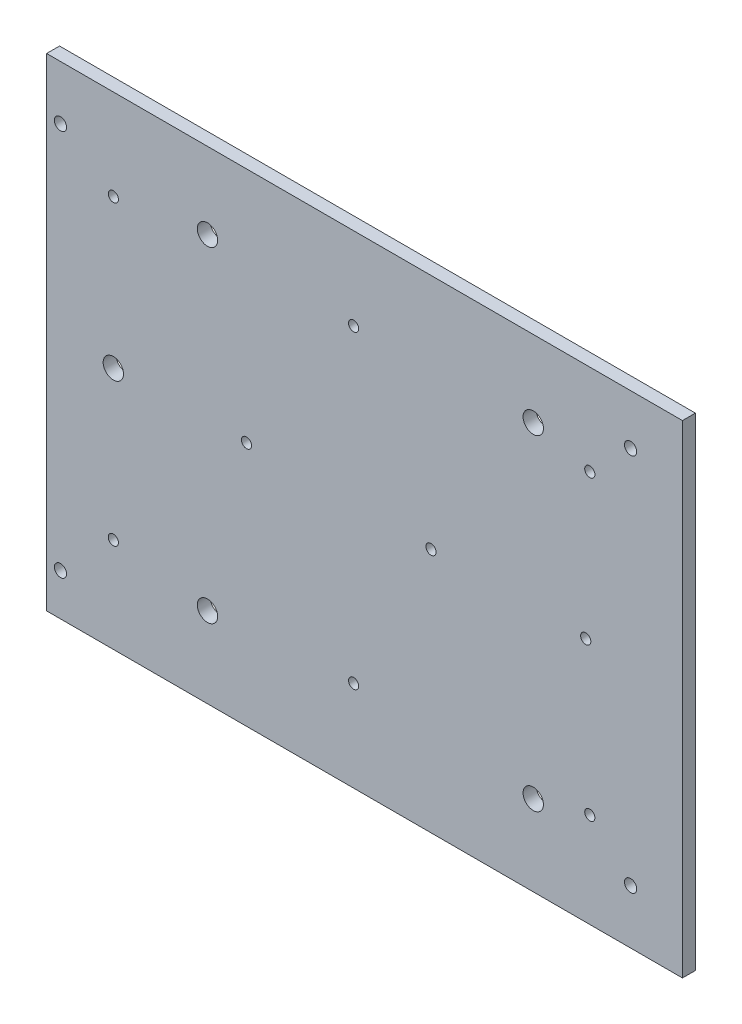
ISO-10303-21;
HEADER;
FILE_DESCRIPTION(('STEP AP214'),'2;1');
FILE_NAME('part.step','',(''),(''),'','','');
FILE_SCHEMA(('AUTOMOTIVE_DESIGN { 1 0 10303 214 1 1 1 1 }'));
ENDSEC;
DATA;
#1=APPLICATION_CONTEXT('core data for automotive mechanical design processes');
#2=APPLICATION_PROTOCOL_DEFINITION('international standard','automotive_design',2000,#1);
#3=PRODUCT_CONTEXT('',#1,'mechanical');
#4=PRODUCT('Part','Part','',(#3));
#5=PRODUCT_RELATED_PRODUCT_CATEGORY('part','',(#4));
#6=PRODUCT_DEFINITION_FORMATION('','',#4);
#7=PRODUCT_DEFINITION_CONTEXT('part definition',#1,'design');
#8=PRODUCT_DEFINITION('design','',#6,#7);
#9=PRODUCT_DEFINITION_SHAPE('','',#8);
#10=(LENGTH_UNIT() NAMED_UNIT(*) SI_UNIT(.MILLI.,.METRE.));
#11=(NAMED_UNIT(*) PLANE_ANGLE_UNIT() SI_UNIT($,.RADIAN.));
#12=(NAMED_UNIT(*) SI_UNIT($,.STERADIAN.) SOLID_ANGLE_UNIT());
#13=UNCERTAINTY_MEASURE_WITH_UNIT(LENGTH_MEASURE(1.E-05),#10,'distance_accuracy_value','');
#14=(GEOMETRIC_REPRESENTATION_CONTEXT(3) GLOBAL_UNCERTAINTY_ASSIGNED_CONTEXT((#13)) GLOBAL_UNIT_ASSIGNED_CONTEXT((#10,
#11,#12)) REPRESENTATION_CONTEXT('',''));
#15=CARTESIAN_POINT('',(0.,0.,0.));
#16=DIRECTION('',(0.,0.,1.));
#17=DIRECTION('',(1.,0.,0.));
#18=AXIS2_PLACEMENT_3D('',#15,#16,#17);
#19=CARTESIAN_POINT('',(0.,0.,0.));
#20=DIRECTION('',(0.,0.,1.));
#21=DIRECTION('',(1.,0.,0.));
#22=AXIS2_PLACEMENT_3D('',#19,#20,#21);
#23=PLANE('',#22);
#24=CARTESIAN_POINT('',(199.336124674479,-104.770846896701,0.));
#25=DIRECTION('',(0.,0.,-1.));
#26=DIRECTION('',(-1.,0.,0.));
#27=AXIS2_PLACEMENT_3D('',#24,#25,#26);
#28=CIRCLE('',#27,1.24999999999997);
#29=CARTESIAN_POINT('',(198.086124674479,-104.770846896701,0.));
#30=VERTEX_POINT('',#29);
#31=EDGE_CURVE('E214',#30,#30,#28,.T.);
#32=ORIENTED_EDGE('',*,*,#31,.F.);
#33=EDGE_LOOP('',(#32));
#34=FACE_BOUND('',#33,.T.);
#35=CARTESIAN_POINT('',(161.336124674479,-104.770846896701,0.));
#36=DIRECTION('',(0.,0.,-1.));
#37=DIRECTION('',(-1.,0.,0.));
#38=AXIS2_PLACEMENT_3D('',#35,#36,#37);
#39=CIRCLE('',#38,1.25);
#40=CARTESIAN_POINT('',(160.086124674479,-104.770846896701,0.));
#41=VERTEX_POINT('',#40);
#42=EDGE_CURVE('E208',#41,#41,#39,.T.);
#43=ORIENTED_EDGE('',*,*,#42,.F.);
#44=EDGE_LOOP('',(#43));
#45=FACE_BOUND('',#44,.T.);
#46=CARTESIAN_POINT('',(116.036124674479,-104.770846896701,0.));
#47=DIRECTION('',(0.,0.,-1.));
#48=DIRECTION('',(-1.,0.,0.));
#49=AXIS2_PLACEMENT_3D('',#46,#47,#48);
#50=CIRCLE('',#49,1.24999999999999);
#51=CARTESIAN_POINT('',(114.786124674479,-104.770846896701,0.));
#52=VERTEX_POINT('',#51);
#53=EDGE_CURVE('E202',#52,#52,#50,.T.);
#54=ORIENTED_EDGE('',*,*,#53,.F.);
#55=EDGE_LOOP('',(#54));
#56=FACE_BOUND('',#55,.T.);
#57=CARTESIAN_POINT('',(142.336124674479,-66.7708468967014,0.));
#58=DIRECTION('',(0.,0.,-1.));
#59=DIRECTION('',(-1.,0.,0.));
#60=AXIS2_PLACEMENT_3D('',#57,#58,#59);
#61=CIRCLE('',#60,1.24999999999997);
#62=CARTESIAN_POINT('',(141.086124674479,-66.7708468967014,0.));
#63=VERTEX_POINT('',#62);
#64=EDGE_CURVE('E196',#63,#63,#61,.T.);
#65=ORIENTED_EDGE('',*,*,#64,.F.);
#66=EDGE_LOOP('',(#65));
#67=FACE_BOUND('',#66,.T.);
#68=CARTESIAN_POINT('',(142.336124674479,-142.770846896701,0.));
#69=DIRECTION('',(0.,0.,-1.));
#70=DIRECTION('',(-1.,0.,0.));
#71=AXIS2_PLACEMENT_3D('',#68,#69,#70);
#72=CIRCLE('',#71,1.24999999999997);
#73=CARTESIAN_POINT('',(141.086124674479,-142.770846896701,0.));
#74=VERTEX_POINT('',#73);
#75=EDGE_CURVE('E190',#74,#74,#72,.T.);
#76=ORIENTED_EDGE('',*,*,#75,.F.);
#77=EDGE_LOOP('',(#76));
#78=FACE_BOUND('',#77,.T.);
#79=CARTESIAN_POINT('',(200.336124674479,-68.7708468967014,0.));
#80=DIRECTION('',(0.,0.,-1.));
#81=DIRECTION('',(-1.,0.,0.));
#82=AXIS2_PLACEMENT_3D('',#79,#80,#81);
#83=CIRCLE('',#82,1.25);
#84=CARTESIAN_POINT('',(199.086124674479,-68.7708468967014,0.));
#85=VERTEX_POINT('',#84);
#86=EDGE_CURVE('E184',#85,#85,#83,.T.);
#87=ORIENTED_EDGE('',*,*,#86,.F.);
#88=EDGE_LOOP('',(#87));
#89=FACE_BOUND('',#88,.T.);
#90=CARTESIAN_POINT('',(83.3361246744791,-68.7708468967014,0.));
#91=DIRECTION('',(0.,0.,-1.));
#92=DIRECTION('',(-1.,0.,0.));
#93=AXIS2_PLACEMENT_3D('',#90,#91,#92);
#94=CIRCLE('',#93,1.25);
#95=CARTESIAN_POINT('',(82.0861246744791,-68.7708468967014,0.));
#96=VERTEX_POINT('',#95);
#97=EDGE_CURVE('E178',#96,#96,#94,.T.);
#98=ORIENTED_EDGE('',*,*,#97,.F.);
#99=EDGE_LOOP('',(#98));
#100=FACE_BOUND('',#99,.T.);
#101=CARTESIAN_POINT('',(83.3361246744791,-141.770846896701,0.));
#102=DIRECTION('',(0.,0.,-1.));
#103=DIRECTION('',(-1.,0.,0.));
#104=AXIS2_PLACEMENT_3D('',#101,#102,#103);
#105=CIRCLE('',#104,1.25);
#106=CARTESIAN_POINT('',(82.0861246744791,-141.770846896701,0.));
#107=VERTEX_POINT('',#106);
#108=EDGE_CURVE('E172',#107,#107,#105,.T.);
#109=ORIENTED_EDGE('',*,*,#108,.F.);
#110=EDGE_LOOP('',(#109));
#111=FACE_BOUND('',#110,.T.);
#112=CARTESIAN_POINT('',(200.336124674479,-141.770846896701,0.));
#113=DIRECTION('',(0.,0.,-1.));
#114=DIRECTION('',(-1.,0.,0.));
#115=AXIS2_PLACEMENT_3D('',#112,#113,#114);
#116=CIRCLE('',#115,1.25);
#117=CARTESIAN_POINT('',(199.086124674479,-141.770846896701,0.));
#118=VERTEX_POINT('',#117);
#119=EDGE_CURVE('E166',#118,#118,#116,.T.);
#120=ORIENTED_EDGE('',*,*,#119,.F.);
#121=EDGE_LOOP('',(#120));
#122=FACE_BOUND('',#121,.T.);
#123=CARTESIAN_POINT('',(210.352674696181,-58.7708468967014,0.));
#124=DIRECTION('',(0.,0.,-1.));
#125=DIRECTION('',(-1.,0.,0.));
#126=AXIS2_PLACEMENT_3D('',#123,#124,#125);
#127=CIRCLE('',#126,1.5);
#128=CARTESIAN_POINT('',(208.852674696181,-58.7708468967014,0.));
#129=VERTEX_POINT('',#128);
#130=EDGE_CURVE('E160',#129,#129,#127,.T.);
#131=ORIENTED_EDGE('',*,*,#130,.F.);
#132=EDGE_LOOP('',(#131));
#133=FACE_BOUND('',#132,.T.);
#134=CARTESIAN_POINT('',(210.352674696181,-151.770846896701,0.));
#135=DIRECTION('',(0.,0.,-1.));
#136=DIRECTION('',(-1.,0.,0.));
#137=AXIS2_PLACEMENT_3D('',#134,#135,#136);
#138=CIRCLE('',#137,1.5);
#139=CARTESIAN_POINT('',(208.852674696181,-151.770846896701,0.));
#140=VERTEX_POINT('',#139);
#141=EDGE_CURVE('E154',#140,#140,#138,.T.);
#142=ORIENTED_EDGE('',*,*,#141,.F.);
#143=EDGE_LOOP('',(#142));
#144=FACE_BOUND('',#143,.T.);
#145=CARTESIAN_POINT('',(70.3526746961806,-154.770846896701,0.));
#146=DIRECTION('',(0.,0.,-1.));
#147=DIRECTION('',(-1.,0.,0.));
#148=AXIS2_PLACEMENT_3D('',#145,#146,#147);
#149=CIRCLE('',#148,1.5);
#150=CARTESIAN_POINT('',(68.8526746961806,-154.770846896701,0.));
#151=VERTEX_POINT('',#150);
#152=EDGE_CURVE('E148',#151,#151,#149,.T.);
#153=ORIENTED_EDGE('',*,*,#152,.F.);
#154=EDGE_LOOP('',(#153));
#155=FACE_BOUND('',#154,.T.);
#156=CARTESIAN_POINT('',(70.3526746961806,-59.7708468967014,0.));
#157=DIRECTION('',(0.,0.,-1.));
#158=DIRECTION('',(-1.,0.,0.));
#159=AXIS2_PLACEMENT_3D('',#156,#157,#158);
#160=CIRCLE('',#159,1.5);
#161=CARTESIAN_POINT('',(68.8526746961806,-59.7708468967014,0.));
#162=VERTEX_POINT('',#161);
#163=EDGE_CURVE('E142',#162,#162,#160,.T.);
#164=ORIENTED_EDGE('',*,*,#163,.F.);
#165=EDGE_LOOP('',(#164));
#166=FACE_BOUND('',#165,.T.);
#167=CARTESIAN_POINT('',(106.452674696181,-65.2708468967014,0.));
#168=DIRECTION('',(0.,0.,1.));
#169=DIRECTION('',(1.,0.,0.));
#170=AXIS2_PLACEMENT_3D('',#167,#168,#169);
#171=CIRCLE('',#170,2.5);
#172=CARTESIAN_POINT('',(108.952674696181,-65.2708468967014,0.));
#173=VERTEX_POINT('',#172);
#174=EDGE_CURVE('E133',#173,#173,#171,.T.);
#175=ORIENTED_EDGE('',*,*,#174,.T.);
#176=EDGE_LOOP('',(#175));
#177=FACE_BOUND('',#176,.T.);
#178=CARTESIAN_POINT('',(186.452674696181,-65.2708468967014,0.));
#179=DIRECTION('',(0.,0.,1.));
#180=DIRECTION('',(1.,0.,0.));
#181=AXIS2_PLACEMENT_3D('',#178,#179,#180);
#182=CIRCLE('',#181,2.5);
#183=CARTESIAN_POINT('',(188.952674696181,-65.2708468967014,0.));
#184=VERTEX_POINT('',#183);
#185=EDGE_CURVE('E127',#184,#184,#182,.T.);
#186=ORIENTED_EDGE('',*,*,#185,.T.);
#187=EDGE_LOOP('',(#186));
#188=FACE_BOUND('',#187,.T.);
#189=CARTESIAN_POINT('',(186.452674696181,-145.270846896701,0.));
#190=DIRECTION('',(0.,0.,1.));
#191=DIRECTION('',(1.,0.,0.));
#192=AXIS2_PLACEMENT_3D('',#189,#190,#191);
#193=CIRCLE('',#192,2.5);
#194=CARTESIAN_POINT('',(188.952674696181,-145.270846896701,0.));
#195=VERTEX_POINT('',#194);
#196=EDGE_CURVE('E121',#195,#195,#193,.T.);
#197=ORIENTED_EDGE('',*,*,#196,.T.);
#198=EDGE_LOOP('',(#197));
#199=FACE_BOUND('',#198,.T.);
#200=CARTESIAN_POINT('',(106.452674696181,-145.270846896701,0.));
#201=DIRECTION('',(0.,0.,1.));
#202=DIRECTION('',(1.,0.,0.));
#203=AXIS2_PLACEMENT_3D('',#200,#201,#202);
#204=CIRCLE('',#203,2.5);
#205=CARTESIAN_POINT('',(108.952674696181,-145.270846896701,0.));
#206=VERTEX_POINT('',#205);
#207=EDGE_CURVE('E105',#206,#206,#204,.T.);
#208=ORIENTED_EDGE('',*,*,#207,.T.);
#209=EDGE_LOOP('',(#208));
#210=FACE_BOUND('',#209,.T.);
#211=DIRECTION('',(0.,-1.,0.));
#212=VECTOR('',#211,1.);
#213=CARTESIAN_POINT('',(66.9526746961806,-46.5208468967014,0.));
#214=LINE('',#213,#212);
#215=CARTESIAN_POINT('',(66.9526746961806,-46.5208468967014,0.));
#216=VERTEX_POINT('',#215);
#217=CARTESIAN_POINT('',(66.9526746961806,-165.065893554687,0.));
#218=VERTEX_POINT('',#217);
#219=EDGE_CURVE('E102',#216,#218,#214,.T.);
#220=ORIENTED_EDGE('',*,*,#219,.F.);
#221=DIRECTION('',(-1.,0.,0.));
#222=VECTOR('',#221,1.);
#223=CARTESIAN_POINT('',(66.9526746961806,-46.5208468967014,0.));
#224=LINE('',#223,#222);
#225=CARTESIAN_POINT('',(223.086124674479,-46.5208468967014,0.));
#226=VERTEX_POINT('',#225);
#227=EDGE_CURVE('E78',#226,#216,#224,.T.);
#228=ORIENTED_EDGE('',*,*,#227,.F.);
#229=DIRECTION('',(0.,1.,0.));
#230=VECTOR('',#229,1.);
#231=CARTESIAN_POINT('',(223.086124674479,-46.5208468967014,0.));
#232=LINE('',#231,#230);
#233=CARTESIAN_POINT('',(223.086124674479,-165.065893554687,0.));
#234=VERTEX_POINT('',#233);
#235=EDGE_CURVE('E72',#234,#226,#232,.T.);
#236=ORIENTED_EDGE('',*,*,#235,.F.);
#237=DIRECTION('',(1.,0.,0.));
#238=VECTOR('',#237,1.);
#239=CARTESIAN_POINT('',(66.9526746961806,-165.065893554687,0.));
#240=LINE('',#239,#238);
#241=EDGE_CURVE('E94',#218,#234,#240,.T.);
#242=ORIENTED_EDGE('',*,*,#241,.F.);
#243=EDGE_LOOP('',(#220,#228,#236,#242));
#244=FACE_BOUND('',#243,.T.);
#245=CARTESIAN_POINT('',(83.3361246744791,-105.270846896701,0.));
#246=DIRECTION('',(0.,0.,-1.));
#247=DIRECTION('',(-1.,0.,0.));
#248=AXIS2_PLACEMENT_3D('',#245,#246,#247);
#249=CIRCLE('',#248,2.5);
#250=CARTESIAN_POINT('',(80.8361246744791,-105.270846896701,0.));
#251=VERTEX_POINT('',#250);
#252=EDGE_CURVE('E220',#251,#251,#249,.T.);
#253=ORIENTED_EDGE('',*,*,#252,.F.);
#254=EDGE_LOOP('',(#253));
#255=FACE_BOUND('',#254,.T.);
#256=ADVANCED_FACE('F38',(#34,#45,#56,#67,#78,#89,#100,#111,#122,#133,#144,#155,#166,#177,#188,
#199,#210,#244,#255),#23,.F.);
#257=CARTESIAN_POINT('',(66.9526746961806,-46.5208468967014,3.175));
#258=DIRECTION('',(1.,0.,0.));
#259=DIRECTION('',(0.,0.,-1.));
#260=AXIS2_PLACEMENT_3D('',#257,#258,#259);
#261=PLANE('',#260);
#262=ORIENTED_EDGE('',*,*,#219,.T.);
#263=DIRECTION('',(0.,0.,-1.));
#264=VECTOR('',#263,1.);
#265=CARTESIAN_POINT('',(66.9526746961806,-165.065893554687,3.175));
#266=LINE('',#265,#264);
#267=CARTESIAN_POINT('',(66.9526746961806,-165.065893554687,3.175));
#268=VERTEX_POINT('',#267);
#269=EDGE_CURVE('E11',#268,#218,#266,.T.);
#270=ORIENTED_EDGE('',*,*,#269,.F.);
#271=DIRECTION('',(0.,-1.,0.));
#272=VECTOR('',#271,1.);
#273=CARTESIAN_POINT('',(66.9526746961806,-46.5208468967014,3.175));
#274=LINE('',#273,#272);
#275=CARTESIAN_POINT('',(66.9526746961806,-46.5208468967014,3.175));
#276=VERTEX_POINT('',#275);
#277=EDGE_CURVE('E90',#276,#268,#274,.T.);
#278=ORIENTED_EDGE('',*,*,#277,.F.);
#279=DIRECTION('',(0.,0.,-1.));
#280=VECTOR('',#279,1.);
#281=CARTESIAN_POINT('',(66.9526746961806,-46.5208468967014,3.175));
#282=LINE('',#281,#280);
#283=EDGE_CURVE('E98',#276,#216,#282,.T.);
#284=ORIENTED_EDGE('',*,*,#283,.T.);
#285=EDGE_LOOP('',(#262,#270,#278,#284));
#286=FACE_BOUND('',#285,.T.);
#287=ADVANCED_FACE('F40',(#286),#261,.F.);
#288=CARTESIAN_POINT('',(66.9526746961806,-165.065893554687,3.175));
#289=DIRECTION('',(0.,1.,0.));
#290=DIRECTION('',(0.,0.,1.));
#291=AXIS2_PLACEMENT_3D('',#288,#289,#290);
#292=PLANE('',#291);
#293=ORIENTED_EDGE('',*,*,#241,.T.);
#294=DIRECTION('',(0.,0.,-1.));
#295=VECTOR('',#294,1.);
#296=CARTESIAN_POINT('',(223.086124674479,-165.065893554687,3.175));
#297=LINE('',#296,#295);
#298=CARTESIAN_POINT('',(223.086124674479,-165.065893554687,3.175));
#299=VERTEX_POINT('',#298);
#300=EDGE_CURVE('E47',#299,#234,#297,.T.);
#301=ORIENTED_EDGE('',*,*,#300,.F.);
#302=DIRECTION('',(1.,0.,0.));
#303=VECTOR('',#302,1.);
#304=CARTESIAN_POINT('',(66.9526746961806,-165.065893554687,3.175));
#305=LINE('',#304,#303);
#306=EDGE_CURVE('E85',#268,#299,#305,.T.);
#307=ORIENTED_EDGE('',*,*,#306,.F.);
#308=ORIENTED_EDGE('',*,*,#269,.T.);
#309=EDGE_LOOP('',(#293,#301,#307,#308));
#310=FACE_BOUND('',#309,.T.);
#311=ADVANCED_FACE('F93',(#310),#292,.F.);
#312=CARTESIAN_POINT('',(223.086124674479,-46.5208468967014,3.175));
#313=DIRECTION('',(-1.,0.,0.));
#314=DIRECTION('',(0.,0.,1.));
#315=AXIS2_PLACEMENT_3D('',#312,#313,#314);
#316=PLANE('',#315);
#317=ORIENTED_EDGE('',*,*,#235,.T.);
#318=DIRECTION('',(0.,0.,-1.));
#319=VECTOR('',#318,1.);
#320=CARTESIAN_POINT('',(223.086124674479,-46.5208468967014,3.175));
#321=LINE('',#320,#319);
#322=CARTESIAN_POINT('',(223.086124674479,-46.5208468967014,3.175));
#323=VERTEX_POINT('',#322);
#324=EDGE_CURVE('E95',#323,#226,#321,.T.);
#325=ORIENTED_EDGE('',*,*,#324,.F.);
#326=DIRECTION('',(0.,1.,0.));
#327=VECTOR('',#326,1.);
#328=CARTESIAN_POINT('',(223.086124674479,-46.5208468967014,3.175));
#329=LINE('',#328,#327);
#330=EDGE_CURVE('E88',#299,#323,#329,.T.);
#331=ORIENTED_EDGE('',*,*,#330,.F.);
#332=ORIENTED_EDGE('',*,*,#300,.T.);
#333=EDGE_LOOP('',(#317,#325,#331,#332));
#334=FACE_BOUND('',#333,.T.);
#335=ADVANCED_FACE('F96',(#334),#316,.F.);
#336=CARTESIAN_POINT('',(66.9526746961806,-46.5208468967014,3.175));
#337=DIRECTION('',(0.,-1.,0.));
#338=DIRECTION('',(0.,0.,-1.));
#339=AXIS2_PLACEMENT_3D('',#336,#337,#338);
#340=PLANE('',#339);
#341=ORIENTED_EDGE('',*,*,#227,.T.);
#342=ORIENTED_EDGE('',*,*,#283,.F.);
#343=DIRECTION('',(-1.,0.,0.));
#344=VECTOR('',#343,1.);
#345=CARTESIAN_POINT('',(66.9526746961806,-46.5208468967014,3.175));
#346=LINE('',#345,#344);
#347=EDGE_CURVE('E55',#323,#276,#346,.T.);
#348=ORIENTED_EDGE('',*,*,#347,.F.);
#349=ORIENTED_EDGE('',*,*,#324,.T.);
#350=EDGE_LOOP('',(#341,#342,#348,#349));
#351=FACE_BOUND('',#350,.T.);
#352=ADVANCED_FACE('F110',(#351),#340,.F.);
#353=CARTESIAN_POINT('',(0.,0.,3.175));
#354=DIRECTION('',(0.,0.,1.));
#355=DIRECTION('',(1.,0.,0.));
#356=AXIS2_PLACEMENT_3D('',#353,#354,#355);
#357=PLANE('',#356);
#358=CARTESIAN_POINT('',(83.3361246744791,-105.270846896701,3.175));
#359=DIRECTION('',(0.,0.,-1.));
#360=DIRECTION('',(-1.,0.,0.));
#361=AXIS2_PLACEMENT_3D('',#358,#359,#360);
#362=CIRCLE('',#361,2.5);
#363=CARTESIAN_POINT('',(80.8361246744791,-105.270846896701,3.175));
#364=VERTEX_POINT('',#363);
#365=EDGE_CURVE('E217',#364,#364,#362,.T.);
#366=ORIENTED_EDGE('',*,*,#365,.T.);
#367=EDGE_LOOP('',(#366));
#368=FACE_BOUND('',#367,.T.);
#369=CARTESIAN_POINT('',(199.336124674479,-104.770846896701,3.175));
#370=DIRECTION('',(0.,0.,-1.));
#371=DIRECTION('',(-1.,0.,0.));
#372=AXIS2_PLACEMENT_3D('',#369,#370,#371);
#373=CIRCLE('',#372,1.25);
#374=CARTESIAN_POINT('',(198.086124674479,-104.770846896701,3.175));
#375=VERTEX_POINT('',#374);
#376=EDGE_CURVE('E211',#375,#375,#373,.T.);
#377=ORIENTED_EDGE('',*,*,#376,.T.);
#378=EDGE_LOOP('',(#377));
#379=FACE_BOUND('',#378,.T.);
#380=CARTESIAN_POINT('',(161.336124674479,-104.770846896701,3.175));
#381=DIRECTION('',(0.,0.,-1.));
#382=DIRECTION('',(-1.,0.,0.));
#383=AXIS2_PLACEMENT_3D('',#380,#381,#382);
#384=CIRCLE('',#383,1.25);
#385=CARTESIAN_POINT('',(160.086124674479,-104.770846896701,3.175));
#386=VERTEX_POINT('',#385);
#387=EDGE_CURVE('E205',#386,#386,#384,.T.);
#388=ORIENTED_EDGE('',*,*,#387,.T.);
#389=EDGE_LOOP('',(#388));
#390=FACE_BOUND('',#389,.T.);
#391=CARTESIAN_POINT('',(116.036124674479,-104.770846896701,3.175));
#392=DIRECTION('',(0.,0.,-1.));
#393=DIRECTION('',(-1.,0.,0.));
#394=AXIS2_PLACEMENT_3D('',#391,#392,#393);
#395=CIRCLE('',#394,1.25);
#396=CARTESIAN_POINT('',(114.786124674479,-104.770846896701,3.175));
#397=VERTEX_POINT('',#396);
#398=EDGE_CURVE('E199',#397,#397,#395,.T.);
#399=ORIENTED_EDGE('',*,*,#398,.T.);
#400=EDGE_LOOP('',(#399));
#401=FACE_BOUND('',#400,.T.);
#402=CARTESIAN_POINT('',(142.336124674479,-66.7708468967014,3.175));
#403=DIRECTION('',(0.,0.,-1.));
#404=DIRECTION('',(-1.,0.,0.));
#405=AXIS2_PLACEMENT_3D('',#402,#403,#404);
#406=CIRCLE('',#405,1.25);
#407=CARTESIAN_POINT('',(141.086124674479,-66.7708468967014,3.175));
#408=VERTEX_POINT('',#407);
#409=EDGE_CURVE('E193',#408,#408,#406,.T.);
#410=ORIENTED_EDGE('',*,*,#409,.T.);
#411=EDGE_LOOP('',(#410));
#412=FACE_BOUND('',#411,.T.);
#413=CARTESIAN_POINT('',(142.336124674479,-142.770846896701,3.175));
#414=DIRECTION('',(0.,0.,-1.));
#415=DIRECTION('',(-1.,0.,0.));
#416=AXIS2_PLACEMENT_3D('',#413,#414,#415);
#417=CIRCLE('',#416,1.25);
#418=CARTESIAN_POINT('',(141.086124674479,-142.770846896701,3.175));
#419=VERTEX_POINT('',#418);
#420=EDGE_CURVE('E187',#419,#419,#417,.T.);
#421=ORIENTED_EDGE('',*,*,#420,.T.);
#422=EDGE_LOOP('',(#421));
#423=FACE_BOUND('',#422,.T.);
#424=CARTESIAN_POINT('',(200.336124674479,-68.7708468967014,3.175));
#425=DIRECTION('',(0.,0.,-1.));
#426=DIRECTION('',(-1.,0.,0.));
#427=AXIS2_PLACEMENT_3D('',#424,#425,#426);
#428=CIRCLE('',#427,1.25);
#429=CARTESIAN_POINT('',(199.086124674479,-68.7708468967014,3.175));
#430=VERTEX_POINT('',#429);
#431=EDGE_CURVE('E181',#430,#430,#428,.T.);
#432=ORIENTED_EDGE('',*,*,#431,.T.);
#433=EDGE_LOOP('',(#432));
#434=FACE_BOUND('',#433,.T.);
#435=CARTESIAN_POINT('',(83.3361246744791,-68.7708468967014,3.175));
#436=DIRECTION('',(0.,0.,-1.));
#437=DIRECTION('',(-1.,0.,0.));
#438=AXIS2_PLACEMENT_3D('',#435,#436,#437);
#439=CIRCLE('',#438,1.25);
#440=CARTESIAN_POINT('',(82.0861246744791,-68.7708468967014,3.175));
#441=VERTEX_POINT('',#440);
#442=EDGE_CURVE('E175',#441,#441,#439,.T.);
#443=ORIENTED_EDGE('',*,*,#442,.T.);
#444=EDGE_LOOP('',(#443));
#445=FACE_BOUND('',#444,.T.);
#446=CARTESIAN_POINT('',(83.3361246744791,-141.770846896701,3.175));
#447=DIRECTION('',(0.,0.,-1.));
#448=DIRECTION('',(-1.,0.,0.));
#449=AXIS2_PLACEMENT_3D('',#446,#447,#448);
#450=CIRCLE('',#449,1.25);
#451=CARTESIAN_POINT('',(82.0861246744791,-141.770846896701,3.175));
#452=VERTEX_POINT('',#451);
#453=EDGE_CURVE('E169',#452,#452,#450,.T.);
#454=ORIENTED_EDGE('',*,*,#453,.T.);
#455=EDGE_LOOP('',(#454));
#456=FACE_BOUND('',#455,.T.);
#457=CARTESIAN_POINT('',(200.336124674479,-141.770846896701,3.175));
#458=DIRECTION('',(0.,0.,-1.));
#459=DIRECTION('',(-1.,0.,0.));
#460=AXIS2_PLACEMENT_3D('',#457,#458,#459);
#461=CIRCLE('',#460,1.25);
#462=CARTESIAN_POINT('',(199.086124674479,-141.770846896701,3.175));
#463=VERTEX_POINT('',#462);
#464=EDGE_CURVE('E163',#463,#463,#461,.T.);
#465=ORIENTED_EDGE('',*,*,#464,.T.);
#466=EDGE_LOOP('',(#465));
#467=FACE_BOUND('',#466,.T.);
#468=CARTESIAN_POINT('',(210.352674696181,-58.7708468967014,3.175));
#469=DIRECTION('',(0.,0.,-1.));
#470=DIRECTION('',(-1.,0.,0.));
#471=AXIS2_PLACEMENT_3D('',#468,#469,#470);
#472=CIRCLE('',#471,1.5);
#473=CARTESIAN_POINT('',(208.852674696181,-58.7708468967014,3.175));
#474=VERTEX_POINT('',#473);
#475=EDGE_CURVE('E157',#474,#474,#472,.T.);
#476=ORIENTED_EDGE('',*,*,#475,.T.);
#477=EDGE_LOOP('',(#476));
#478=FACE_BOUND('',#477,.T.);
#479=CARTESIAN_POINT('',(210.352674696181,-151.770846896701,3.175));
#480=DIRECTION('',(0.,0.,-1.));
#481=DIRECTION('',(-1.,0.,0.));
#482=AXIS2_PLACEMENT_3D('',#479,#480,#481);
#483=CIRCLE('',#482,1.5);
#484=CARTESIAN_POINT('',(208.852674696181,-151.770846896701,3.175));
#485=VERTEX_POINT('',#484);
#486=EDGE_CURVE('E151',#485,#485,#483,.T.);
#487=ORIENTED_EDGE('',*,*,#486,.T.);
#488=EDGE_LOOP('',(#487));
#489=FACE_BOUND('',#488,.T.);
#490=CARTESIAN_POINT('',(70.3526746961806,-154.770846896701,3.175));
#491=DIRECTION('',(0.,0.,-1.));
#492=DIRECTION('',(-1.,0.,0.));
#493=AXIS2_PLACEMENT_3D('',#490,#491,#492);
#494=CIRCLE('',#493,1.5);
#495=CARTESIAN_POINT('',(68.8526746961806,-154.770846896701,3.175));
#496=VERTEX_POINT('',#495);
#497=EDGE_CURVE('E145',#496,#496,#494,.T.);
#498=ORIENTED_EDGE('',*,*,#497,.T.);
#499=EDGE_LOOP('',(#498));
#500=FACE_BOUND('',#499,.T.);
#501=CARTESIAN_POINT('',(70.3526746961806,-59.7708468967014,3.175));
#502=DIRECTION('',(0.,0.,-1.));
#503=DIRECTION('',(-1.,0.,0.));
#504=AXIS2_PLACEMENT_3D('',#501,#502,#503);
#505=CIRCLE('',#504,1.5);
#506=CARTESIAN_POINT('',(68.8526746961806,-59.7708468967014,3.175));
#507=VERTEX_POINT('',#506);
#508=EDGE_CURVE('E139',#507,#507,#505,.T.);
#509=ORIENTED_EDGE('',*,*,#508,.T.);
#510=EDGE_LOOP('',(#509));
#511=FACE_BOUND('',#510,.T.);
#512=CARTESIAN_POINT('',(106.452674696181,-65.2708468967014,3.175));
#513=DIRECTION('',(0.,0.,1.));
#514=DIRECTION('',(1.,0.,0.));
#515=AXIS2_PLACEMENT_3D('',#512,#513,#514);
#516=CIRCLE('',#515,2.5);
#517=CARTESIAN_POINT('',(108.952674696181,-65.2708468967014,3.175));
#518=VERTEX_POINT('',#517);
#519=EDGE_CURVE('E136',#518,#518,#516,.T.);
#520=ORIENTED_EDGE('',*,*,#519,.F.);
#521=EDGE_LOOP('',(#520));
#522=FACE_BOUND('',#521,.T.);
#523=CARTESIAN_POINT('',(186.452674696181,-65.2708468967014,3.175));
#524=DIRECTION('',(0.,0.,1.));
#525=DIRECTION('',(1.,0.,0.));
#526=AXIS2_PLACEMENT_3D('',#523,#524,#525);
#527=CIRCLE('',#526,2.5);
#528=CARTESIAN_POINT('',(188.952674696181,-65.2708468967014,3.175));
#529=VERTEX_POINT('',#528);
#530=EDGE_CURVE('E130',#529,#529,#527,.T.);
#531=ORIENTED_EDGE('',*,*,#530,.F.);
#532=EDGE_LOOP('',(#531));
#533=FACE_BOUND('',#532,.T.);
#534=CARTESIAN_POINT('',(186.452674696181,-145.270846896701,3.175));
#535=DIRECTION('',(0.,0.,1.));
#536=DIRECTION('',(1.,0.,0.));
#537=AXIS2_PLACEMENT_3D('',#534,#535,#536);
#538=CIRCLE('',#537,2.5);
#539=CARTESIAN_POINT('',(188.952674696181,-145.270846896701,3.175));
#540=VERTEX_POINT('',#539);
#541=EDGE_CURVE('E124',#540,#540,#538,.T.);
#542=ORIENTED_EDGE('',*,*,#541,.F.);
#543=EDGE_LOOP('',(#542));
#544=FACE_BOUND('',#543,.T.);
#545=CARTESIAN_POINT('',(106.452674696181,-145.270846896701,3.175));
#546=DIRECTION('',(0.,0.,1.));
#547=DIRECTION('',(1.,0.,0.));
#548=AXIS2_PLACEMENT_3D('',#545,#546,#547);
#549=CIRCLE('',#548,2.5);
#550=CARTESIAN_POINT('',(108.952674696181,-145.270846896701,3.175));
#551=VERTEX_POINT('',#550);
#552=EDGE_CURVE('E118',#551,#551,#549,.T.);
#553=ORIENTED_EDGE('',*,*,#552,.F.);
#554=EDGE_LOOP('',(#553));
#555=FACE_BOUND('',#554,.T.);
#556=ORIENTED_EDGE('',*,*,#277,.T.);
#557=ORIENTED_EDGE('',*,*,#306,.T.);
#558=ORIENTED_EDGE('',*,*,#330,.T.);
#559=ORIENTED_EDGE('',*,*,#347,.T.);
#560=EDGE_LOOP('',(#556,#557,#558,#559));
#561=FACE_BOUND('',#560,.T.);
#562=ADVANCED_FACE('F86',(#368,#379,#390,#401,#412,#423,#434,#445,#456,#467,#478,#489,#500,#511,
#522,#533,#544,#555,#561),#357,.T.);
#563=CARTESIAN_POINT('',(106.452674696181,-145.270846896701,3.175));
#564=DIRECTION('',(0.,0.,1.));
#565=DIRECTION('',(1.,0.,0.));
#566=AXIS2_PLACEMENT_3D('',#563,#564,#565);
#567=CYLINDRICAL_SURFACE('',#566,2.5);
#568=ORIENTED_EDGE('',*,*,#207,.F.);
#569=EDGE_LOOP('',(#568));
#570=FACE_BOUND('',#569,.T.);
#571=ORIENTED_EDGE('',*,*,#552,.T.);
#572=EDGE_LOOP('',(#571));
#573=FACE_BOUND('',#572,.T.);
#574=ADVANCED_FACE('F259',(#570,#573),#567,.F.);
#575=CARTESIAN_POINT('',(186.452674696181,-145.270846896701,3.175));
#576=DIRECTION('',(0.,0.,1.));
#577=DIRECTION('',(1.,0.,0.));
#578=AXIS2_PLACEMENT_3D('',#575,#576,#577);
#579=CYLINDRICAL_SURFACE('',#578,2.5);
#580=ORIENTED_EDGE('',*,*,#196,.F.);
#581=EDGE_LOOP('',(#580));
#582=FACE_BOUND('',#581,.T.);
#583=ORIENTED_EDGE('',*,*,#541,.T.);
#584=EDGE_LOOP('',(#583));
#585=FACE_BOUND('',#584,.T.);
#586=ADVANCED_FACE('F266',(#582,#585),#579,.F.);
#587=CARTESIAN_POINT('',(186.452674696181,-65.2708468967014,3.175));
#588=DIRECTION('',(0.,0.,1.));
#589=DIRECTION('',(1.,0.,0.));
#590=AXIS2_PLACEMENT_3D('',#587,#588,#589);
#591=CYLINDRICAL_SURFACE('',#590,2.5);
#592=ORIENTED_EDGE('',*,*,#185,.F.);
#593=EDGE_LOOP('',(#592));
#594=FACE_BOUND('',#593,.T.);
#595=ORIENTED_EDGE('',*,*,#530,.T.);
#596=EDGE_LOOP('',(#595));
#597=FACE_BOUND('',#596,.T.);
#598=ADVANCED_FACE('F273',(#594,#597),#591,.F.);
#599=CARTESIAN_POINT('',(106.452674696181,-65.2708468967014,3.175));
#600=DIRECTION('',(0.,0.,1.));
#601=DIRECTION('',(1.,0.,0.));
#602=AXIS2_PLACEMENT_3D('',#599,#600,#601);
#603=CYLINDRICAL_SURFACE('',#602,2.5);
#604=ORIENTED_EDGE('',*,*,#174,.F.);
#605=EDGE_LOOP('',(#604));
#606=FACE_BOUND('',#605,.T.);
#607=ORIENTED_EDGE('',*,*,#519,.T.);
#608=EDGE_LOOP('',(#607));
#609=FACE_BOUND('',#608,.T.);
#610=ADVANCED_FACE('F281',(#606,#609),#603,.F.);
#611=CARTESIAN_POINT('',(70.3526746961806,-59.7708468967014,0.));
#612=DIRECTION('',(0.,0.,-1.));
#613=DIRECTION('',(-1.,0.,0.));
#614=AXIS2_PLACEMENT_3D('',#611,#612,#613);
#615=CYLINDRICAL_SURFACE('',#614,1.5);
#616=ORIENTED_EDGE('',*,*,#508,.F.);
#617=EDGE_LOOP('',(#616));
#618=FACE_BOUND('',#617,.T.);
#619=ORIENTED_EDGE('',*,*,#163,.T.);
#620=EDGE_LOOP('',(#619));
#621=FACE_BOUND('',#620,.T.);
#622=ADVANCED_FACE('F289',(#618,#621),#615,.F.);
#623=CARTESIAN_POINT('',(70.3526746961806,-154.770846896701,0.));
#624=DIRECTION('',(0.,0.,-1.));
#625=DIRECTION('',(-1.,0.,0.));
#626=AXIS2_PLACEMENT_3D('',#623,#624,#625);
#627=CYLINDRICAL_SURFACE('',#626,1.5);
#628=ORIENTED_EDGE('',*,*,#497,.F.);
#629=EDGE_LOOP('',(#628));
#630=FACE_BOUND('',#629,.T.);
#631=ORIENTED_EDGE('',*,*,#152,.T.);
#632=EDGE_LOOP('',(#631));
#633=FACE_BOUND('',#632,.T.);
#634=ADVANCED_FACE('F297',(#630,#633),#627,.F.);
#635=CARTESIAN_POINT('',(210.352674696181,-151.770846896701,0.));
#636=DIRECTION('',(0.,0.,-1.));
#637=DIRECTION('',(-1.,0.,0.));
#638=AXIS2_PLACEMENT_3D('',#635,#636,#637);
#639=CYLINDRICAL_SURFACE('',#638,1.5);
#640=ORIENTED_EDGE('',*,*,#486,.F.);
#641=EDGE_LOOP('',(#640));
#642=FACE_BOUND('',#641,.T.);
#643=ORIENTED_EDGE('',*,*,#141,.T.);
#644=EDGE_LOOP('',(#643));
#645=FACE_BOUND('',#644,.T.);
#646=ADVANCED_FACE('F305',(#642,#645),#639,.F.);
#647=CARTESIAN_POINT('',(210.352674696181,-58.7708468967014,0.));
#648=DIRECTION('',(0.,0.,-1.));
#649=DIRECTION('',(-1.,0.,0.));
#650=AXIS2_PLACEMENT_3D('',#647,#648,#649);
#651=CYLINDRICAL_SURFACE('',#650,1.5);
#652=ORIENTED_EDGE('',*,*,#475,.F.);
#653=EDGE_LOOP('',(#652));
#654=FACE_BOUND('',#653,.T.);
#655=ORIENTED_EDGE('',*,*,#130,.T.);
#656=EDGE_LOOP('',(#655));
#657=FACE_BOUND('',#656,.T.);
#658=ADVANCED_FACE('F313',(#654,#657),#651,.F.);
#659=CARTESIAN_POINT('',(200.336124674479,-141.770846896701,0.));
#660=DIRECTION('',(0.,0.,-1.));
#661=DIRECTION('',(-1.,0.,0.));
#662=AXIS2_PLACEMENT_3D('',#659,#660,#661);
#663=CYLINDRICAL_SURFACE('',#662,1.25);
#664=ORIENTED_EDGE('',*,*,#464,.F.);
#665=EDGE_LOOP('',(#664));
#666=FACE_BOUND('',#665,.T.);
#667=ORIENTED_EDGE('',*,*,#119,.T.);
#668=EDGE_LOOP('',(#667));
#669=FACE_BOUND('',#668,.T.);
#670=ADVANCED_FACE('F321',(#666,#669),#663,.F.);
#671=CARTESIAN_POINT('',(83.3361246744791,-141.770846896701,0.));
#672=DIRECTION('',(0.,0.,-1.));
#673=DIRECTION('',(-1.,0.,0.));
#674=AXIS2_PLACEMENT_3D('',#671,#672,#673);
#675=CYLINDRICAL_SURFACE('',#674,1.25);
#676=ORIENTED_EDGE('',*,*,#453,.F.);
#677=EDGE_LOOP('',(#676));
#678=FACE_BOUND('',#677,.T.);
#679=ORIENTED_EDGE('',*,*,#108,.T.);
#680=EDGE_LOOP('',(#679));
#681=FACE_BOUND('',#680,.T.);
#682=ADVANCED_FACE('F329',(#678,#681),#675,.F.);
#683=CARTESIAN_POINT('',(83.3361246744791,-68.7708468967014,0.));
#684=DIRECTION('',(0.,0.,-1.));
#685=DIRECTION('',(-1.,0.,0.));
#686=AXIS2_PLACEMENT_3D('',#683,#684,#685);
#687=CYLINDRICAL_SURFACE('',#686,1.25);
#688=ORIENTED_EDGE('',*,*,#442,.F.);
#689=EDGE_LOOP('',(#688));
#690=FACE_BOUND('',#689,.T.);
#691=ORIENTED_EDGE('',*,*,#97,.T.);
#692=EDGE_LOOP('',(#691));
#693=FACE_BOUND('',#692,.T.);
#694=ADVANCED_FACE('F337',(#690,#693),#687,.F.);
#695=CARTESIAN_POINT('',(200.336124674479,-68.7708468967014,0.));
#696=DIRECTION('',(0.,0.,-1.));
#697=DIRECTION('',(-1.,0.,0.));
#698=AXIS2_PLACEMENT_3D('',#695,#696,#697);
#699=CYLINDRICAL_SURFACE('',#698,1.25);
#700=ORIENTED_EDGE('',*,*,#431,.F.);
#701=EDGE_LOOP('',(#700));
#702=FACE_BOUND('',#701,.T.);
#703=ORIENTED_EDGE('',*,*,#86,.T.);
#704=EDGE_LOOP('',(#703));
#705=FACE_BOUND('',#704,.T.);
#706=ADVANCED_FACE('F345',(#702,#705),#699,.F.);
#707=CARTESIAN_POINT('',(142.336124674479,-142.770846896701,0.));
#708=DIRECTION('',(0.,0.,-1.));
#709=DIRECTION('',(-1.,0.,0.));
#710=AXIS2_PLACEMENT_3D('',#707,#708,#709);
#711=CYLINDRICAL_SURFACE('',#710,1.24999999999999);
#712=ORIENTED_EDGE('',*,*,#420,.F.);
#713=EDGE_LOOP('',(#712));
#714=FACE_BOUND('',#713,.T.);
#715=ORIENTED_EDGE('',*,*,#75,.T.);
#716=EDGE_LOOP('',(#715));
#717=FACE_BOUND('',#716,.T.);
#718=ADVANCED_FACE('F353',(#714,#717),#711,.F.);
#719=CARTESIAN_POINT('',(142.336124674479,-66.7708468967014,0.));
#720=DIRECTION('',(0.,0.,-1.));
#721=DIRECTION('',(-1.,0.,0.));
#722=AXIS2_PLACEMENT_3D('',#719,#720,#721);
#723=CYLINDRICAL_SURFACE('',#722,1.24999999999999);
#724=ORIENTED_EDGE('',*,*,#409,.F.);
#725=EDGE_LOOP('',(#724));
#726=FACE_BOUND('',#725,.T.);
#727=ORIENTED_EDGE('',*,*,#64,.T.);
#728=EDGE_LOOP('',(#727));
#729=FACE_BOUND('',#728,.T.);
#730=ADVANCED_FACE('F361',(#726,#729),#723,.F.);
#731=CARTESIAN_POINT('',(116.036124674479,-104.770846896701,0.));
#732=DIRECTION('',(0.,0.,-1.));
#733=DIRECTION('',(-1.,0.,0.));
#734=AXIS2_PLACEMENT_3D('',#731,#732,#733);
#735=CYLINDRICAL_SURFACE('',#734,1.24999999999999);
#736=ORIENTED_EDGE('',*,*,#398,.F.);
#737=EDGE_LOOP('',(#736));
#738=FACE_BOUND('',#737,.T.);
#739=ORIENTED_EDGE('',*,*,#53,.T.);
#740=EDGE_LOOP('',(#739));
#741=FACE_BOUND('',#740,.T.);
#742=ADVANCED_FACE('F369',(#738,#741),#735,.F.);
#743=CARTESIAN_POINT('',(161.336124674479,-104.770846896701,0.));
#744=DIRECTION('',(0.,0.,-1.));
#745=DIRECTION('',(-1.,0.,0.));
#746=AXIS2_PLACEMENT_3D('',#743,#744,#745);
#747=CYLINDRICAL_SURFACE('',#746,1.25);
#748=ORIENTED_EDGE('',*,*,#387,.F.);
#749=EDGE_LOOP('',(#748));
#750=FACE_BOUND('',#749,.T.);
#751=ORIENTED_EDGE('',*,*,#42,.T.);
#752=EDGE_LOOP('',(#751));
#753=FACE_BOUND('',#752,.T.);
#754=ADVANCED_FACE('F377',(#750,#753),#747,.F.);
#755=CARTESIAN_POINT('',(199.336124674479,-104.770846896701,0.));
#756=DIRECTION('',(0.,0.,-1.));
#757=DIRECTION('',(-1.,0.,0.));
#758=AXIS2_PLACEMENT_3D('',#755,#756,#757);
#759=CYLINDRICAL_SURFACE('',#758,1.24999999999999);
#760=ORIENTED_EDGE('',*,*,#376,.F.);
#761=EDGE_LOOP('',(#760));
#762=FACE_BOUND('',#761,.T.);
#763=ORIENTED_EDGE('',*,*,#31,.T.);
#764=EDGE_LOOP('',(#763));
#765=FACE_BOUND('',#764,.T.);
#766=ADVANCED_FACE('F385',(#762,#765),#759,.F.);
#767=CARTESIAN_POINT('',(83.3361246744791,-105.270846896701,0.));
#768=DIRECTION('',(0.,0.,-1.));
#769=DIRECTION('',(-1.,0.,0.));
#770=AXIS2_PLACEMENT_3D('',#767,#768,#769);
#771=CYLINDRICAL_SURFACE('',#770,2.5);
#772=ORIENTED_EDGE('',*,*,#365,.F.);
#773=EDGE_LOOP('',(#772));
#774=FACE_BOUND('',#773,.T.);
#775=ORIENTED_EDGE('',*,*,#252,.T.);
#776=EDGE_LOOP('',(#775));
#777=FACE_BOUND('',#776,.T.);
#778=ADVANCED_FACE('F224',(#774,#777),#771,.F.);
#779=CLOSED_SHELL('',(#256,#287,#311,#335,#352,#562,#574,#586,#598,#610,#622,#634,#646,#658,
#670,#682,#694,#706,#718,#730,#742,#754,#766,#778));
#780=MANIFOLD_SOLID_BREP('B2',#779);
#781=ADVANCED_BREP_SHAPE_REPRESENTATION('',(#18,#780),#14);
#782=SHAPE_DEFINITION_REPRESENTATION(#9,#781);
ENDSEC;
END-ISO-10303-21;
